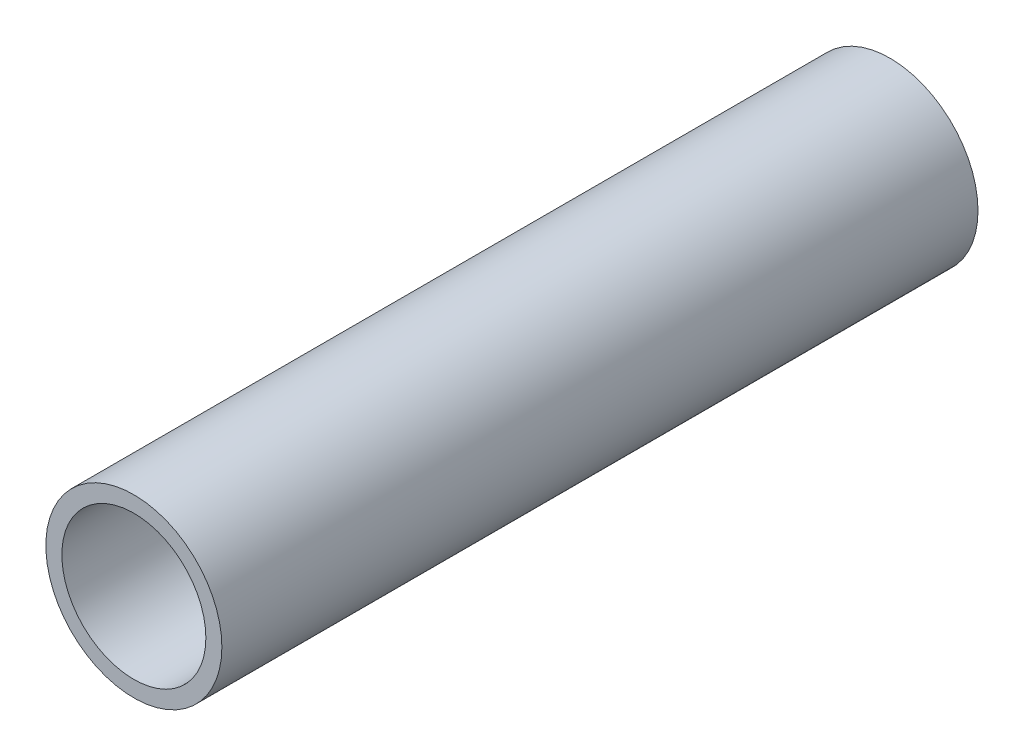
ISO-10303-21;
HEADER;
FILE_DESCRIPTION(('STEP AP214'),'2;1');
FILE_NAME('part.step','',(''),(''),'','','');
FILE_SCHEMA(('AUTOMOTIVE_DESIGN { 1 0 10303 214 1 1 1 1 }'));
ENDSEC;
DATA;
#1=APPLICATION_CONTEXT('core data for automotive mechanical design processes');
#2=APPLICATION_PROTOCOL_DEFINITION('international standard','automotive_design',2000,#1);
#3=PRODUCT_CONTEXT('',#1,'mechanical');
#4=PRODUCT('Part','Part','',(#3));
#5=PRODUCT_RELATED_PRODUCT_CATEGORY('part','',(#4));
#6=PRODUCT_DEFINITION_FORMATION('','',#4);
#7=PRODUCT_DEFINITION_CONTEXT('part definition',#1,'design');
#8=PRODUCT_DEFINITION('design','',#6,#7);
#9=PRODUCT_DEFINITION_SHAPE('','',#8);
#10=(LENGTH_UNIT() NAMED_UNIT(*) SI_UNIT(.MILLI.,.METRE.));
#11=(NAMED_UNIT(*) PLANE_ANGLE_UNIT() SI_UNIT($,.RADIAN.));
#12=(NAMED_UNIT(*) SI_UNIT($,.STERADIAN.) SOLID_ANGLE_UNIT());
#13=UNCERTAINTY_MEASURE_WITH_UNIT(LENGTH_MEASURE(1.E-05),#10,'distance_accuracy_value','');
#14=(GEOMETRIC_REPRESENTATION_CONTEXT(3) GLOBAL_UNCERTAINTY_ASSIGNED_CONTEXT((#13)) GLOBAL_UNIT_ASSIGNED_CONTEXT((#10,
#11,#12)) REPRESENTATION_CONTEXT('',''));
#15=CARTESIAN_POINT('',(0.,0.,0.));
#16=DIRECTION('',(0.,0.,1.));
#17=DIRECTION('',(1.,0.,0.));
#18=AXIS2_PLACEMENT_3D('',#15,#16,#17);
#19=CARTESIAN_POINT('',(0.,0.,94.5));
#20=DIRECTION('',(0.,0.,1.));
#21=DIRECTION('',(1.,0.,0.));
#22=AXIS2_PLACEMENT_3D('',#19,#20,#21);
#23=PLANE('',#22);
#24=CARTESIAN_POINT('',(0.,0.,94.5));
#25=DIRECTION('',(0.,0.,1.));
#26=DIRECTION('',(1.,0.,0.));
#27=AXIS2_PLACEMENT_3D('',#24,#25,#26);
#28=CIRCLE('',#27,11.);
#29=CARTESIAN_POINT('',(11.,0.,94.5));
#30=VERTEX_POINT('',#29);
#31=EDGE_CURVE('E10',#30,#30,#28,.T.);
#32=ORIENTED_EDGE('',*,*,#31,.T.);
#33=EDGE_LOOP('',(#32));
#34=FACE_BOUND('',#33,.T.);
#35=CARTESIAN_POINT('',(0.,0.,94.5));
#36=DIRECTION('',(0.,0.,1.));
#37=DIRECTION('',(1.,0.,0.));
#38=AXIS2_PLACEMENT_3D('',#35,#36,#37);
#39=CIRCLE('',#38,9.);
#40=CARTESIAN_POINT('',(9.,0.,94.5));
#41=VERTEX_POINT('',#40);
#42=EDGE_CURVE('E42',#41,#41,#39,.T.);
#43=ORIENTED_EDGE('',*,*,#42,.F.);
#44=EDGE_LOOP('',(#43));
#45=FACE_BOUND('',#44,.T.);
#46=ADVANCED_FACE('F31',(#34,#45),#23,.T.);
#47=CARTESIAN_POINT('',(0.,0.,0.));
#48=DIRECTION('',(0.,0.,1.));
#49=DIRECTION('',(1.,0.,0.));
#50=AXIS2_PLACEMENT_3D('',#47,#48,#49);
#51=PLANE('',#50);
#52=CARTESIAN_POINT('',(0.,0.,0.));
#53=DIRECTION('',(0.,0.,1.));
#54=DIRECTION('',(1.,0.,0.));
#55=AXIS2_PLACEMENT_3D('',#52,#53,#54);
#56=CIRCLE('',#55,11.);
#57=CARTESIAN_POINT('',(11.,0.,0.));
#58=VERTEX_POINT('',#57);
#59=EDGE_CURVE('E35',#58,#58,#56,.T.);
#60=ORIENTED_EDGE('',*,*,#59,.F.);
#61=EDGE_LOOP('',(#60));
#62=FACE_BOUND('',#61,.T.);
#63=CARTESIAN_POINT('',(0.,0.,0.));
#64=DIRECTION('',(0.,0.,1.));
#65=DIRECTION('',(1.,0.,0.));
#66=AXIS2_PLACEMENT_3D('',#63,#64,#65);
#67=CIRCLE('',#66,9.);
#68=CARTESIAN_POINT('',(9.,0.,0.));
#69=VERTEX_POINT('',#68);
#70=EDGE_CURVE('E44',#69,#69,#67,.T.);
#71=ORIENTED_EDGE('',*,*,#70,.T.);
#72=EDGE_LOOP('',(#71));
#73=FACE_BOUND('',#72,.T.);
#74=ADVANCED_FACE('F54',(#62,#73),#51,.F.);
#75=CARTESIAN_POINT('',(0.,0.,94.5));
#76=DIRECTION('',(0.,0.,-1.));
#77=DIRECTION('',(-1.,0.,0.));
#78=AXIS2_PLACEMENT_3D('',#75,#76,#77);
#79=CYLINDRICAL_SURFACE('',#78,11.);
#80=ORIENTED_EDGE('',*,*,#31,.F.);
#81=EDGE_LOOP('',(#80));
#82=FACE_BOUND('',#81,.T.);
#83=ORIENTED_EDGE('',*,*,#59,.T.);
#84=EDGE_LOOP('',(#83));
#85=FACE_BOUND('',#84,.T.);
#86=ADVANCED_FACE('F33',(#82,#85),#79,.T.);
#87=CARTESIAN_POINT('',(0.,0.,94.5));
#88=DIRECTION('',(0.,0.,-1.));
#89=DIRECTION('',(-1.,0.,0.));
#90=AXIS2_PLACEMENT_3D('',#87,#88,#89);
#91=CYLINDRICAL_SURFACE('',#90,9.);
#92=ORIENTED_EDGE('',*,*,#42,.T.);
#93=EDGE_LOOP('',(#92));
#94=FACE_BOUND('',#93,.T.);
#95=ORIENTED_EDGE('',*,*,#70,.F.);
#96=EDGE_LOOP('',(#95));
#97=FACE_BOUND('',#96,.T.);
#98=ADVANCED_FACE('F50',(#94,#97),#91,.F.);
#99=CLOSED_SHELL('',(#46,#74,#86,#98));
#100=MANIFOLD_SOLID_BREP('B2',#99);
#101=ADVANCED_BREP_SHAPE_REPRESENTATION('',(#18,#100),#14);
#102=SHAPE_DEFINITION_REPRESENTATION(#9,#101);
ENDSEC;
END-ISO-10303-21;
